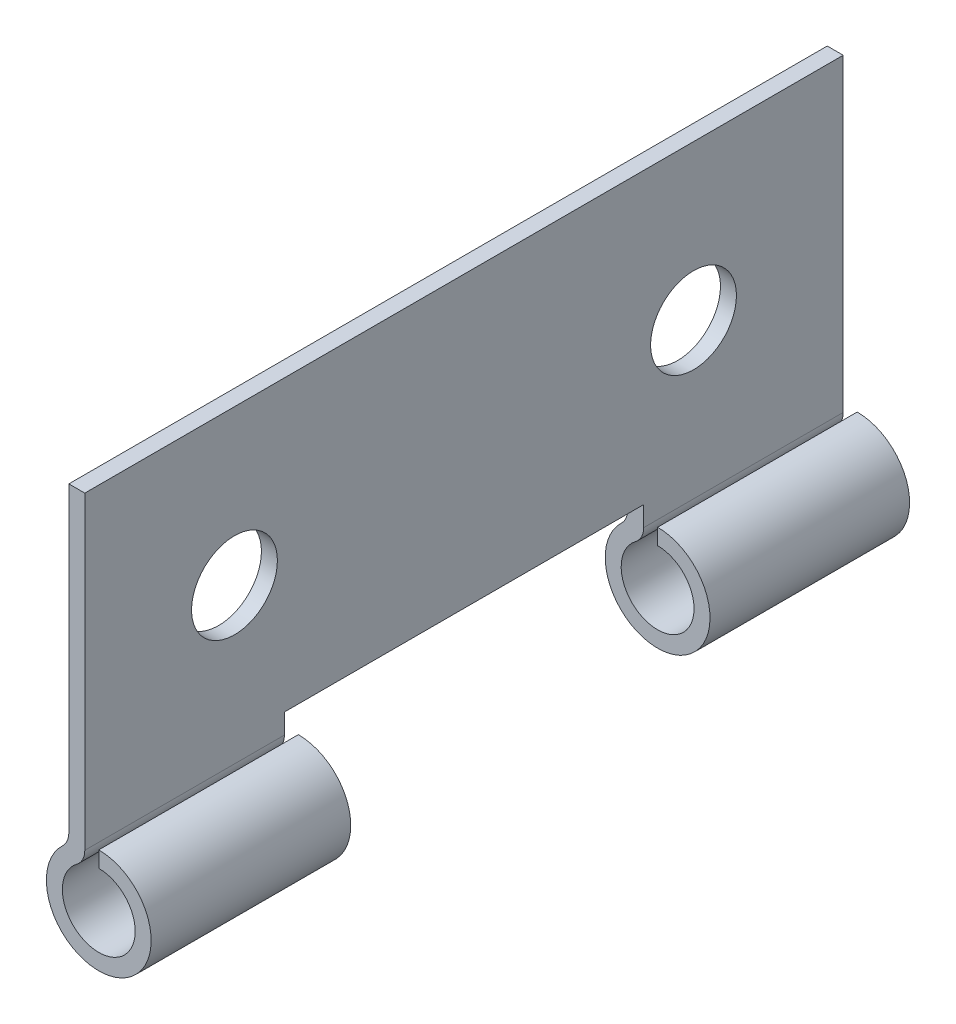
ISO-10303-21;
HEADER;
FILE_DESCRIPTION(('STEP AP214'),'2;1');
FILE_NAME('part.step','',(''),(''),'','','');
FILE_SCHEMA(('AUTOMOTIVE_DESIGN { 1 0 10303 214 1 1 1 1 }'));
ENDSEC;
DATA;
#1=APPLICATION_CONTEXT('core data for automotive mechanical design processes');
#2=APPLICATION_PROTOCOL_DEFINITION('international standard','automotive_design',2000,#1);
#3=PRODUCT_CONTEXT('',#1,'mechanical');
#4=PRODUCT('Part','Part','',(#3));
#5=PRODUCT_RELATED_PRODUCT_CATEGORY('part','',(#4));
#6=PRODUCT_DEFINITION_FORMATION('','',#4);
#7=PRODUCT_DEFINITION_CONTEXT('part definition',#1,'design');
#8=PRODUCT_DEFINITION('design','',#6,#7);
#9=PRODUCT_DEFINITION_SHAPE('','',#8);
#10=(LENGTH_UNIT() NAMED_UNIT(*) SI_UNIT(.MILLI.,.METRE.));
#11=(NAMED_UNIT(*) PLANE_ANGLE_UNIT() SI_UNIT($,.RADIAN.));
#12=(NAMED_UNIT(*) SI_UNIT($,.STERADIAN.) SOLID_ANGLE_UNIT());
#13=UNCERTAINTY_MEASURE_WITH_UNIT(LENGTH_MEASURE(1.E-05),#10,'distance_accuracy_value','');
#14=(GEOMETRIC_REPRESENTATION_CONTEXT(3) GLOBAL_UNCERTAINTY_ASSIGNED_CONTEXT((#13)) GLOBAL_UNIT_ASSIGNED_CONTEXT((#10,
#11,#12)) REPRESENTATION_CONTEXT('',''));
#15=CARTESIAN_POINT('',(0.,0.,0.));
#16=DIRECTION('',(0.,0.,1.));
#17=DIRECTION('',(1.,0.,0.));
#18=AXIS2_PLACEMENT_3D('',#15,#16,#17);
#19=CARTESIAN_POINT('',(0.,0.,38.));
#20=DIRECTION('',(1.,0.,0.));
#21=DIRECTION('',(0.,0.,-1.));
#22=AXIS2_PLACEMENT_3D('',#19,#20,#21);
#23=PLANE('',#22);
#24=CARTESIAN_POINT('',(0.,7.38124134347369,7.5));
#25=DIRECTION('',(1.,0.,0.));
#26=DIRECTION('',(0.,0.,-1.));
#27=AXIS2_PLACEMENT_3D('',#24,#25,#26);
#28=CIRCLE('',#27,2.15);
#29=CARTESIAN_POINT('',(0.,7.38124134347369,5.35));
#30=VERTEX_POINT('',#29);
#31=EDGE_CURVE('E248',#30,#30,#28,.F.);
#32=ORIENTED_EDGE('',*,*,#31,.F.);
#33=EDGE_LOOP('',(#32));
#34=FACE_BOUND('',#33,.T.);
#35=CARTESIAN_POINT('',(0.,7.38124134347369,30.5));
#36=DIRECTION('',(1.,0.,0.));
#37=DIRECTION('',(0.,0.,-1.));
#38=AXIS2_PLACEMENT_3D('',#35,#36,#37);
#39=CIRCLE('',#38,2.15);
#40=CARTESIAN_POINT('',(0.,7.38124134347369,28.35));
#41=VERTEX_POINT('',#40);
#42=EDGE_CURVE('E149',#41,#41,#39,.F.);
#43=ORIENTED_EDGE('',*,*,#42,.F.);
#44=EDGE_LOOP('',(#43));
#45=FACE_BOUND('',#44,.T.);
#46=DIRECTION('',(0.,-1.,0.));
#47=VECTOR('',#46,1.);
#48=CARTESIAN_POINT('',(0.,0.,9.99999999999999));
#49=LINE('',#48,#47);
#50=CARTESIAN_POINT('',(0.,0.631241343473685,10.));
#51=VERTEX_POINT('',#50);
#52=CARTESIAN_POINT('',(0.,0.,9.99999999999999));
#53=VERTEX_POINT('',#52);
#54=EDGE_CURVE('E241',#51,#53,#49,.T.);
#55=ORIENTED_EDGE('',*,*,#54,.F.);
#56=DIRECTION('',(0.,0.,-1.));
#57=VECTOR('',#56,1.);
#58=CARTESIAN_POINT('',(0.,0.631241343473685,38.));
#59=LINE('',#58,#57);
#60=CARTESIAN_POINT('',(0.,0.631241343473685,28.));
#61=VERTEX_POINT('',#60);
#62=EDGE_CURVE('E208',#61,#51,#59,.T.);
#63=ORIENTED_EDGE('',*,*,#62,.F.);
#64=DIRECTION('',(0.,-1.,0.));
#65=VECTOR('',#64,1.);
#66=CARTESIAN_POINT('',(0.,0.,28.));
#67=LINE('',#66,#65);
#68=CARTESIAN_POINT('',(0.,0.,28.));
#69=VERTEX_POINT('',#68);
#70=EDGE_CURVE('E223',#61,#69,#67,.T.);
#71=ORIENTED_EDGE('',*,*,#70,.T.);
#72=DIRECTION('',(0.,0.,-1.));
#73=VECTOR('',#72,1.);
#74=CARTESIAN_POINT('',(0.,0.,38.));
#75=LINE('',#74,#73);
#76=CARTESIAN_POINT('',(0.,0.,38.));
#77=VERTEX_POINT('',#76);
#78=EDGE_CURVE('E183',#77,#69,#75,.T.);
#79=ORIENTED_EDGE('',*,*,#78,.F.);
#80=DIRECTION('',(0.,-1.,0.));
#81=VECTOR('',#80,1.);
#82=CARTESIAN_POINT('',(0.,0.,38.));
#83=LINE('',#82,#81);
#84=CARTESIAN_POINT('',(0.,15.1312413434737,38.));
#85=VERTEX_POINT('',#84);
#86=EDGE_CURVE('E98',#85,#77,#83,.T.);
#87=ORIENTED_EDGE('',*,*,#86,.F.);
#88=DIRECTION('',(0.,0.,-1.));
#89=VECTOR('',#88,1.);
#90=CARTESIAN_POINT('',(0.,15.1312413434737,38.));
#91=LINE('',#90,#89);
#92=CARTESIAN_POINT('',(0.,15.1312413434737,0.));
#93=VERTEX_POINT('',#92);
#94=EDGE_CURVE('E186',#85,#93,#91,.T.);
#95=ORIENTED_EDGE('',*,*,#94,.T.);
#96=DIRECTION('',(0.,-1.,0.));
#97=VECTOR('',#96,1.);
#98=CARTESIAN_POINT('',(0.,0.,0.));
#99=LINE('',#98,#97);
#100=CARTESIAN_POINT('',(0.,0.,0.));
#101=VERTEX_POINT('',#100);
#102=EDGE_CURVE('E148',#93,#101,#99,.T.);
#103=ORIENTED_EDGE('',*,*,#102,.T.);
#104=EDGE_CURVE('E182',#53,#101,#75,.T.);
#105=ORIENTED_EDGE('',*,*,#104,.F.);
#106=EDGE_LOOP('',(#55,#63,#71,#79,#87,#95,#103,#105));
#107=FACE_BOUND('',#106,.T.);
#108=ADVANCED_FACE('F34',(#34,#45,#107),#23,.F.);
#109=CARTESIAN_POINT('',(-1.,0.,38.));
#110=DIRECTION('',(0.,0.,-1.));
#111=DIRECTION('',(-1.,0.,0.));
#112=AXIS2_PLACEMENT_3D('',#109,#110,#111);
#113=CYLINDRICAL_SURFACE('',#112,1.);
#114=CARTESIAN_POINT('',(-1.,0.,9.99999999999999));
#115=DIRECTION('',(0.,0.,1.));
#116=DIRECTION('',(1.,0.,0.));
#117=AXIS2_PLACEMENT_3D('',#114,#115,#116);
#118=CIRCLE('',#117,1.);
#119=CARTESIAN_POINT('',(-0.310344827586207,-0.724137931034484,9.99999999999999));
#120=VERTEX_POINT('',#119);
#121=EDGE_CURVE('E238',#53,#120,#118,.F.);
#122=ORIENTED_EDGE('',*,*,#121,.F.);
#123=ORIENTED_EDGE('',*,*,#104,.T.);
#124=CARTESIAN_POINT('',(-1.,0.,0.));
#125=DIRECTION('',(0.,0.,-1.));
#126=DIRECTION('',(-1.,0.,0.));
#127=AXIS2_PLACEMENT_3D('',#124,#125,#126);
#128=CIRCLE('',#127,1.);
#129=CARTESIAN_POINT('',(-0.310344827586207,-0.724137931034484,0.));
#130=VERTEX_POINT('',#129);
#131=EDGE_CURVE('E152',#101,#130,#128,.T.);
#132=ORIENTED_EDGE('',*,*,#131,.T.);
#133=DIRECTION('',(0.,0.,-1.));
#134=VECTOR('',#133,1.);
#135=CARTESIAN_POINT('',(-0.310344827586207,-0.724137931034484,38.));
#136=LINE('',#135,#134);
#137=EDGE_CURVE('E178',#120,#130,#136,.T.);
#138=ORIENTED_EDGE('',*,*,#137,.F.);
#139=EDGE_LOOP('',(#122,#123,#132,#138));
#140=FACE_BOUND('',#139,.T.);
#141=ADVANCED_FACE('F298',(#140),#113,.F.);
#142=CARTESIAN_POINT('',(1.5,-2.625,38.));
#143=DIRECTION('',(0.,0.,-1.));
#144=DIRECTION('',(-1.,0.,0.));
#145=AXIS2_PLACEMENT_3D('',#142,#143,#144);
#146=CYLINDRICAL_SURFACE('',#145,2.625);
#147=DIRECTION('',(0.,0.,-1.));
#148=VECTOR('',#147,1.);
#149=CARTESIAN_POINT('',(1.5,0.,38.));
#150=LINE('',#149,#148);
#151=CARTESIAN_POINT('',(1.5,0.,9.99999999999999));
#152=VERTEX_POINT('',#151);
#153=CARTESIAN_POINT('',(1.5,0.,0.));
#154=VERTEX_POINT('',#153);
#155=EDGE_CURVE('E174',#152,#154,#150,.T.);
#156=ORIENTED_EDGE('',*,*,#155,.F.);
#157=CARTESIAN_POINT('',(1.5,-2.625,9.99999999999999));
#158=DIRECTION('',(0.,0.,1.));
#159=DIRECTION('',(1.,0.,0.));
#160=AXIS2_PLACEMENT_3D('',#157,#158,#159);
#161=CIRCLE('',#160,2.625);
#162=EDGE_CURVE('E235',#120,#152,#161,.T.);
#163=ORIENTED_EDGE('',*,*,#162,.F.);
#164=ORIENTED_EDGE('',*,*,#137,.T.);
#165=CARTESIAN_POINT('',(1.5,-2.625,0.));
#166=DIRECTION('',(0.,0.,1.));
#167=DIRECTION('',(1.,0.,0.));
#168=AXIS2_PLACEMENT_3D('',#165,#166,#167);
#169=CIRCLE('',#168,2.625);
#170=EDGE_CURVE('E155',#130,#154,#169,.T.);
#171=ORIENTED_EDGE('',*,*,#170,.T.);
#172=EDGE_LOOP('',(#156,#163,#164,#171));
#173=FACE_BOUND('',#172,.T.);
#174=ADVANCED_FACE('F309',(#173),#146,.T.);
#175=CARTESIAN_POINT('',(1.5,-2.625,28.));
#176=DIRECTION('',(0.,0.,1.));
#177=DIRECTION('',(1.,0.,0.));
#178=AXIS2_PLACEMENT_3D('',#175,#176,#177);
#179=CIRCLE('',#178,2.625);
#180=CARTESIAN_POINT('',(-0.310344827586207,-0.724137931034484,28.));
#181=VERTEX_POINT('',#180);
#182=CARTESIAN_POINT('',(1.5,0.,28.));
#183=VERTEX_POINT('',#182);
#184=EDGE_CURVE('E217',#181,#183,#179,.T.);
#185=ORIENTED_EDGE('',*,*,#184,.T.);
#186=CARTESIAN_POINT('',(1.5,0.,38.));
#187=VERTEX_POINT('',#186);
#188=EDGE_CURVE('E175',#187,#183,#150,.T.);
#189=ORIENTED_EDGE('',*,*,#188,.F.);
#190=CARTESIAN_POINT('',(1.5,-2.625,38.));
#191=DIRECTION('',(0.,0.,1.));
#192=DIRECTION('',(1.,0.,0.));
#193=AXIS2_PLACEMENT_3D('',#190,#191,#192);
#194=CIRCLE('',#193,2.625);
#195=CARTESIAN_POINT('',(-0.310344827586207,-0.724137931034484,38.));
#196=VERTEX_POINT('',#195);
#197=EDGE_CURVE('E259',#196,#187,#194,.T.);
#198=ORIENTED_EDGE('',*,*,#197,.F.);
#199=EDGE_CURVE('E179',#196,#181,#136,.T.);
#200=ORIENTED_EDGE('',*,*,#199,.T.);
#201=EDGE_LOOP('',(#185,#189,#198,#200));
#202=FACE_BOUND('',#201,.T.);
#203=ADVANCED_FACE('F265',(#202),#146,.T.);
#204=CARTESIAN_POINT('',(1.5,0.,38.));
#205=DIRECTION('',(1.,0.,0.));
#206=DIRECTION('',(0.,0.,-1.));
#207=AXIS2_PLACEMENT_3D('',#204,#205,#206);
#208=PLANE('',#207);
#209=DIRECTION('',(0.,-1.,0.));
#210=VECTOR('',#209,1.);
#211=CARTESIAN_POINT('',(1.5,0.,9.99999999999999));
#212=LINE('',#211,#210);
#213=CARTESIAN_POINT('',(1.5,-0.8,9.99999999999999));
#214=VERTEX_POINT('',#213);
#215=EDGE_CURVE('E232',#152,#214,#212,.T.);
#216=ORIENTED_EDGE('',*,*,#215,.F.);
#217=ORIENTED_EDGE('',*,*,#155,.T.);
#218=DIRECTION('',(0.,-1.,0.));
#219=VECTOR('',#218,1.);
#220=CARTESIAN_POINT('',(1.5,0.,0.));
#221=LINE('',#220,#219);
#222=CARTESIAN_POINT('',(1.5,-0.8,0.));
#223=VERTEX_POINT('',#222);
#224=EDGE_CURVE('E158',#154,#223,#221,.T.);
#225=ORIENTED_EDGE('',*,*,#224,.T.);
#226=DIRECTION('',(0.,0.,-1.));
#227=VECTOR('',#226,1.);
#228=CARTESIAN_POINT('',(1.5,-0.8,38.));
#229=LINE('',#228,#227);
#230=EDGE_CURVE('E134',#214,#223,#229,.T.);
#231=ORIENTED_EDGE('',*,*,#230,.F.);
#232=EDGE_LOOP('',(#216,#217,#225,#231));
#233=FACE_BOUND('',#232,.T.);
#234=ADVANCED_FACE('F314',(#233),#208,.F.);
#235=CARTESIAN_POINT('',(1.5,-2.625,38.));
#236=DIRECTION('',(0.,0.,-1.));
#237=DIRECTION('',(-1.,0.,0.));
#238=AXIS2_PLACEMENT_3D('',#235,#236,#237);
#239=CYLINDRICAL_SURFACE('',#238,1.825);
#240=CARTESIAN_POINT('',(1.5,-2.625,9.99999999999999));
#241=DIRECTION('',(0.,0.,1.));
#242=DIRECTION('',(1.,0.,0.));
#243=AXIS2_PLACEMENT_3D('',#240,#241,#242);
#244=CIRCLE('',#243,1.825);
#245=CARTESIAN_POINT('',(0.401769911504423,-1.16742815864089,9.99999999999999));
#246=VERTEX_POINT('',#245);
#247=EDGE_CURVE('E229',#214,#246,#244,.F.);
#248=ORIENTED_EDGE('',*,*,#247,.F.);
#249=ORIENTED_EDGE('',*,*,#230,.T.);
#250=CARTESIAN_POINT('',(1.5,-2.625,0.));
#251=DIRECTION('',(0.,0.,-1.));
#252=DIRECTION('',(1.,0.,0.));
#253=AXIS2_PLACEMENT_3D('',#250,#251,#252);
#254=CIRCLE('',#253,1.825);
#255=CARTESIAN_POINT('',(0.401769911504423,-1.16742815864089,0.));
#256=VERTEX_POINT('',#255);
#257=EDGE_CURVE('E161',#223,#256,#254,.T.);
#258=ORIENTED_EDGE('',*,*,#257,.T.);
#259=DIRECTION('',(0.,0.,-1.));
#260=VECTOR('',#259,1.);
#261=CARTESIAN_POINT('',(0.401769911504423,-1.16742815864089,38.));
#262=LINE('',#261,#260);
#263=EDGE_CURVE('E135',#246,#256,#262,.T.);
#264=ORIENTED_EDGE('',*,*,#263,.F.);
#265=EDGE_LOOP('',(#248,#249,#258,#264));
#266=FACE_BOUND('',#265,.T.);
#267=ADVANCED_FACE('F316',(#266),#239,.F.);
#268=CARTESIAN_POINT('',(-0.200000000000001,-0.368758656526303,38.));
#269=DIRECTION('',(0.,0.,-1.));
#270=DIRECTION('',(-1.,0.,0.));
#271=AXIS2_PLACEMENT_3D('',#268,#269,#270);
#272=CYLINDRICAL_SURFACE('',#271,1.);
#273=CARTESIAN_POINT('',(-0.200000000000001,-0.368758656526303,9.99999999999999));
#274=DIRECTION('',(0.,0.,1.));
#275=DIRECTION('',(1.,0.,0.));
#276=AXIS2_PLACEMENT_3D('',#273,#274,#275);
#277=CIRCLE('',#276,1.);
#278=CARTESIAN_POINT('',(0.799999999999999,-0.368758656526303,9.99999999999999));
#279=VERTEX_POINT('',#278);
#280=EDGE_CURVE('E226',#246,#279,#277,.T.);
#281=ORIENTED_EDGE('',*,*,#280,.F.);
#282=ORIENTED_EDGE('',*,*,#263,.T.);
#283=CARTESIAN_POINT('',(-0.200000000000001,-0.368758656526303,0.));
#284=DIRECTION('',(0.,0.,1.));
#285=DIRECTION('',(1.,0.,0.));
#286=AXIS2_PLACEMENT_3D('',#283,#284,#285);
#287=CIRCLE('',#286,1.);
#288=CARTESIAN_POINT('',(0.799999999999999,-0.368758656526303,0.));
#289=VERTEX_POINT('',#288);
#290=EDGE_CURVE('E164',#256,#289,#287,.T.);
#291=ORIENTED_EDGE('',*,*,#290,.T.);
#292=DIRECTION('',(0.,0.,-1.));
#293=VECTOR('',#292,1.);
#294=CARTESIAN_POINT('',(0.799999999999999,-0.368758656526303,38.));
#295=LINE('',#294,#293);
#296=EDGE_CURVE('E170',#279,#289,#295,.T.);
#297=ORIENTED_EDGE('',*,*,#296,.F.);
#298=EDGE_LOOP('',(#281,#282,#291,#297));
#299=FACE_BOUND('',#298,.T.);
#300=ADVANCED_FACE('F322',(#299),#272,.T.);
#301=CARTESIAN_POINT('',(0.799999999999999,-0.368758656526303,38.));
#302=DIRECTION('',(-1.,0.,0.));
#303=DIRECTION('',(0.,0.,1.));
#304=AXIS2_PLACEMENT_3D('',#301,#302,#303);
#305=PLANE('',#304);
#306=CARTESIAN_POINT('',(0.799999999999999,7.38124134347369,7.5));
#307=DIRECTION('',(1.,0.,0.));
#308=DIRECTION('',(0.,0.,-1.));
#309=AXIS2_PLACEMENT_3D('',#306,#307,#308);
#310=CIRCLE('',#309,2.15);
#311=CARTESIAN_POINT('',(0.799999999999999,7.38124134347369,5.35));
#312=VERTEX_POINT('',#311);
#313=EDGE_CURVE('E244',#312,#312,#310,.T.);
#314=ORIENTED_EDGE('',*,*,#313,.F.);
#315=EDGE_LOOP('',(#314));
#316=FACE_BOUND('',#315,.T.);
#317=CARTESIAN_POINT('',(0.799999999999999,7.38124134347369,30.5));
#318=DIRECTION('',(1.,0.,0.));
#319=DIRECTION('',(0.,0.,-1.));
#320=AXIS2_PLACEMENT_3D('',#317,#318,#319);
#321=CIRCLE('',#320,2.15);
#322=CARTESIAN_POINT('',(0.799999999999999,7.38124134347369,28.35));
#323=VERTEX_POINT('',#322);
#324=EDGE_CURVE('E245',#323,#323,#321,.T.);
#325=ORIENTED_EDGE('',*,*,#324,.F.);
#326=EDGE_LOOP('',(#325));
#327=FACE_BOUND('',#326,.T.);
#328=DIRECTION('',(0.,1.,0.));
#329=VECTOR('',#328,1.);
#330=CARTESIAN_POINT('',(0.799999999999999,-0.368758656526303,9.99999999999999));
#331=LINE('',#330,#329);
#332=CARTESIAN_POINT('',(0.799999999999999,0.631241343473685,10.));
#333=VERTEX_POINT('',#332);
#334=EDGE_CURVE('E11',#279,#333,#331,.T.);
#335=ORIENTED_EDGE('',*,*,#334,.F.);
#336=ORIENTED_EDGE('',*,*,#296,.T.);
#337=DIRECTION('',(0.,1.,0.));
#338=VECTOR('',#337,1.);
#339=CARTESIAN_POINT('',(0.799999999999999,-0.368758656526303,0.));
#340=LINE('',#339,#338);
#341=CARTESIAN_POINT('',(0.799999999999999,15.1312413434737,0.));
#342=VERTEX_POINT('',#341);
#343=EDGE_CURVE('E89',#289,#342,#340,.T.);
#344=ORIENTED_EDGE('',*,*,#343,.T.);
#345=DIRECTION('',(0.,0.,-1.));
#346=VECTOR('',#345,1.);
#347=CARTESIAN_POINT('',(0.799999999999999,15.1312413434737,38.));
#348=LINE('',#347,#346);
#349=CARTESIAN_POINT('',(0.799999999999999,15.1312413434737,38.));
#350=VERTEX_POINT('',#349);
#351=EDGE_CURVE('E141',#350,#342,#348,.T.);
#352=ORIENTED_EDGE('',*,*,#351,.F.);
#353=DIRECTION('',(0.,1.,0.));
#354=VECTOR('',#353,1.);
#355=CARTESIAN_POINT('',(0.799999999999999,-0.368758656526303,38.));
#356=LINE('',#355,#354);
#357=CARTESIAN_POINT('',(0.799999999999999,-0.368758656526303,38.));
#358=VERTEX_POINT('',#357);
#359=EDGE_CURVE('E57',#358,#350,#356,.T.);
#360=ORIENTED_EDGE('',*,*,#359,.F.);
#361=CARTESIAN_POINT('',(0.799999999999999,-0.368758656526303,28.));
#362=VERTEX_POINT('',#361);
#363=EDGE_CURVE('E139',#358,#362,#295,.T.);
#364=ORIENTED_EDGE('',*,*,#363,.T.);
#365=DIRECTION('',(0.,1.,0.));
#366=VECTOR('',#365,1.);
#367=CARTESIAN_POINT('',(0.799999999999999,-0.368758656526303,28.));
#368=LINE('',#367,#366);
#369=CARTESIAN_POINT('',(0.799999999999999,0.631241343473685,28.));
#370=VERTEX_POINT('',#369);
#371=EDGE_CURVE('E42',#362,#370,#368,.T.);
#372=ORIENTED_EDGE('',*,*,#371,.T.);
#373=DIRECTION('',(0.,0.,1.));
#374=VECTOR('',#373,1.);
#375=CARTESIAN_POINT('',(0.799999999999999,0.631241343473685,38.));
#376=LINE('',#375,#374);
#377=EDGE_CURVE('E188',#333,#370,#376,.T.);
#378=ORIENTED_EDGE('',*,*,#377,.F.);
#379=EDGE_LOOP('',(#335,#336,#344,#352,#360,#364,#372,#378));
#380=FACE_BOUND('',#379,.T.);
#381=ADVANCED_FACE('F194',(#316,#327,#380),#305,.F.);
#382=CARTESIAN_POINT('',(0.,15.1312413434737,38.));
#383=DIRECTION('',(0.,-1.,0.));
#384=DIRECTION('',(0.,0.,-1.));
#385=AXIS2_PLACEMENT_3D('',#382,#383,#384);
#386=PLANE('',#385);
#387=DIRECTION('',(-1.,0.,0.));
#388=VECTOR('',#387,1.);
#389=CARTESIAN_POINT('',(0.,15.1312413434737,0.));
#390=LINE('',#389,#388);
#391=EDGE_CURVE('E145',#342,#93,#390,.T.);
#392=ORIENTED_EDGE('',*,*,#391,.T.);
#393=ORIENTED_EDGE('',*,*,#94,.F.);
#394=DIRECTION('',(-1.,0.,0.));
#395=VECTOR('',#394,1.);
#396=CARTESIAN_POINT('',(0.,15.1312413434737,38.));
#397=LINE('',#396,#395);
#398=EDGE_CURVE('E168',#350,#85,#397,.T.);
#399=ORIENTED_EDGE('',*,*,#398,.F.);
#400=ORIENTED_EDGE('',*,*,#351,.T.);
#401=EDGE_LOOP('',(#392,#393,#399,#400));
#402=FACE_BOUND('',#401,.T.);
#403=ADVANCED_FACE('F36',(#402),#386,.F.);
#404=ORIENTED_EDGE('',*,*,#78,.T.);
#405=CARTESIAN_POINT('',(-1.,0.,28.));
#406=DIRECTION('',(0.,0.,1.));
#407=DIRECTION('',(1.,0.,0.));
#408=AXIS2_PLACEMENT_3D('',#405,#406,#407);
#409=CIRCLE('',#408,1.);
#410=EDGE_CURVE('E220',#69,#181,#409,.F.);
#411=ORIENTED_EDGE('',*,*,#410,.T.);
#412=ORIENTED_EDGE('',*,*,#199,.F.);
#413=CARTESIAN_POINT('',(-1.,0.,38.));
#414=DIRECTION('',(0.,0.,-1.));
#415=DIRECTION('',(-1.,0.,0.));
#416=AXIS2_PLACEMENT_3D('',#413,#414,#415);
#417=CIRCLE('',#416,1.);
#418=EDGE_CURVE('E257',#77,#196,#417,.T.);
#419=ORIENTED_EDGE('',*,*,#418,.F.);
#420=EDGE_LOOP('',(#404,#411,#412,#419));
#421=FACE_BOUND('',#420,.T.);
#422=ADVANCED_FACE('F326',(#421),#113,.F.);
#423=ORIENTED_EDGE('',*,*,#188,.T.);
#424=DIRECTION('',(0.,-1.,0.));
#425=VECTOR('',#424,1.);
#426=CARTESIAN_POINT('',(1.5,0.,28.));
#427=LINE('',#426,#425);
#428=CARTESIAN_POINT('',(1.5,-0.8,28.));
#429=VERTEX_POINT('',#428);
#430=EDGE_CURVE('E210',#183,#429,#427,.T.);
#431=ORIENTED_EDGE('',*,*,#430,.T.);
#432=CARTESIAN_POINT('',(1.5,-0.8,38.));
#433=VERTEX_POINT('',#432);
#434=EDGE_CURVE('E172',#433,#429,#229,.T.);
#435=ORIENTED_EDGE('',*,*,#434,.F.);
#436=DIRECTION('',(0.,-1.,0.));
#437=VECTOR('',#436,1.);
#438=CARTESIAN_POINT('',(1.5,0.,38.));
#439=LINE('',#438,#437);
#440=EDGE_CURVE('E120',#187,#433,#439,.T.);
#441=ORIENTED_EDGE('',*,*,#440,.F.);
#442=EDGE_LOOP('',(#423,#431,#435,#441));
#443=FACE_BOUND('',#442,.T.);
#444=ADVANCED_FACE('F270',(#443),#208,.F.);
#445=ORIENTED_EDGE('',*,*,#434,.T.);
#446=CARTESIAN_POINT('',(1.5,-2.625,28.));
#447=DIRECTION('',(0.,0.,1.));
#448=DIRECTION('',(1.,0.,0.));
#449=AXIS2_PLACEMENT_3D('',#446,#447,#448);
#450=CIRCLE('',#449,1.825);
#451=CARTESIAN_POINT('',(0.401769911504423,-1.16742815864089,28.));
#452=VERTEX_POINT('',#451);
#453=EDGE_CURVE('E131',#429,#452,#450,.F.);
#454=ORIENTED_EDGE('',*,*,#453,.T.);
#455=CARTESIAN_POINT('',(0.401769911504423,-1.16742815864089,38.));
#456=VERTEX_POINT('',#455);
#457=EDGE_CURVE('E127',#456,#452,#262,.T.);
#458=ORIENTED_EDGE('',*,*,#457,.F.);
#459=CARTESIAN_POINT('',(1.5,-2.625,38.));
#460=DIRECTION('',(0.,0.,-1.));
#461=DIRECTION('',(1.,0.,0.));
#462=AXIS2_PLACEMENT_3D('',#459,#460,#461);
#463=CIRCLE('',#462,1.825);
#464=EDGE_CURVE('E113',#433,#456,#463,.T.);
#465=ORIENTED_EDGE('',*,*,#464,.F.);
#466=EDGE_LOOP('',(#445,#454,#458,#465));
#467=FACE_BOUND('',#466,.T.);
#468=ADVANCED_FACE('F128',(#467),#239,.F.);
#469=ORIENTED_EDGE('',*,*,#457,.T.);
#470=CARTESIAN_POINT('',(-0.200000000000001,-0.368758656526303,28.));
#471=DIRECTION('',(0.,0.,1.));
#472=DIRECTION('',(1.,0.,0.));
#473=AXIS2_PLACEMENT_3D('',#470,#471,#472);
#474=CIRCLE('',#473,1.);
#475=EDGE_CURVE('E203',#452,#362,#474,.T.);
#476=ORIENTED_EDGE('',*,*,#475,.T.);
#477=ORIENTED_EDGE('',*,*,#363,.F.);
#478=CARTESIAN_POINT('',(-0.200000000000001,-0.368758656526303,38.));
#479=DIRECTION('',(0.,0.,1.));
#480=DIRECTION('',(1.,0.,0.));
#481=AXIS2_PLACEMENT_3D('',#478,#479,#480);
#482=CIRCLE('',#481,1.);
#483=EDGE_CURVE('E117',#456,#358,#482,.T.);
#484=ORIENTED_EDGE('',*,*,#483,.F.);
#485=EDGE_LOOP('',(#469,#476,#477,#484));
#486=FACE_BOUND('',#485,.T.);
#487=ADVANCED_FACE('F137',(#486),#272,.T.);
#488=CARTESIAN_POINT('',(-0.200000000000001,-0.368758656526303,38.));
#489=DIRECTION('',(0.,0.,1.));
#490=DIRECTION('',(1.,0.,0.));
#491=AXIS2_PLACEMENT_3D('',#488,#489,#490);
#492=PLANE('',#491);
#493=ORIENTED_EDGE('',*,*,#398,.T.);
#494=ORIENTED_EDGE('',*,*,#86,.T.);
#495=ORIENTED_EDGE('',*,*,#418,.T.);
#496=ORIENTED_EDGE('',*,*,#197,.T.);
#497=ORIENTED_EDGE('',*,*,#440,.T.);
#498=ORIENTED_EDGE('',*,*,#464,.T.);
#499=ORIENTED_EDGE('',*,*,#483,.T.);
#500=ORIENTED_EDGE('',*,*,#359,.T.);
#501=EDGE_LOOP('',(#493,#494,#495,#496,#497,#498,#499,#500));
#502=FACE_BOUND('',#501,.T.);
#503=ADVANCED_FACE('F115',(#502),#492,.T.);
#504=CARTESIAN_POINT('',(-0.200000000000001,-0.368758656526303,0.));
#505=DIRECTION('',(0.,0.,1.));
#506=DIRECTION('',(1.,0.,0.));
#507=AXIS2_PLACEMENT_3D('',#504,#505,#506);
#508=PLANE('',#507);
#509=ORIENTED_EDGE('',*,*,#391,.F.);
#510=ORIENTED_EDGE('',*,*,#343,.F.);
#511=ORIENTED_EDGE('',*,*,#290,.F.);
#512=ORIENTED_EDGE('',*,*,#257,.F.);
#513=ORIENTED_EDGE('',*,*,#224,.F.);
#514=ORIENTED_EDGE('',*,*,#170,.F.);
#515=ORIENTED_EDGE('',*,*,#131,.F.);
#516=ORIENTED_EDGE('',*,*,#102,.F.);
#517=EDGE_LOOP('',(#509,#510,#511,#512,#513,#514,#515,#516));
#518=FACE_BOUND('',#517,.T.);
#519=ADVANCED_FACE('F304',(#518),#508,.F.);
#520=CARTESIAN_POINT('',(-1.126,7.38124134347369,7.5));
#521=DIRECTION('',(1.,0.,0.));
#522=DIRECTION('',(0.,0.,-1.));
#523=AXIS2_PLACEMENT_3D('',#520,#521,#522);
#524=CYLINDRICAL_SURFACE('',#523,2.15);
#525=ORIENTED_EDGE('',*,*,#313,.T.);
#526=EDGE_LOOP('',(#525));
#527=FACE_BOUND('',#526,.T.);
#528=ORIENTED_EDGE('',*,*,#31,.T.);
#529=EDGE_LOOP('',(#528));
#530=FACE_BOUND('',#529,.T.);
#531=ADVANCED_FACE('F361',(#527,#530),#524,.F.);
#532=CARTESIAN_POINT('',(-1.126,7.38124134347369,30.5));
#533=DIRECTION('',(1.,0.,0.));
#534=DIRECTION('',(0.,0.,-1.));
#535=AXIS2_PLACEMENT_3D('',#532,#533,#534);
#536=CYLINDRICAL_SURFACE('',#535,2.15);
#537=ORIENTED_EDGE('',*,*,#324,.T.);
#538=EDGE_LOOP('',(#537));
#539=FACE_BOUND('',#538,.T.);
#540=ORIENTED_EDGE('',*,*,#42,.T.);
#541=EDGE_LOOP('',(#540));
#542=FACE_BOUND('',#541,.T.);
#543=ADVANCED_FACE('F366',(#539,#542),#536,.F.);
#544=CARTESIAN_POINT('',(-1.125,0.,10.));
#545=DIRECTION('',(0.,0.,1.));
#546=DIRECTION('',(1.,0.,0.));
#547=AXIS2_PLACEMENT_3D('',#544,#545,#546);
#548=PLANE('',#547);
#549=ORIENTED_EDGE('',*,*,#54,.T.);
#550=ORIENTED_EDGE('',*,*,#121,.T.);
#551=ORIENTED_EDGE('',*,*,#162,.T.);
#552=ORIENTED_EDGE('',*,*,#215,.T.);
#553=ORIENTED_EDGE('',*,*,#247,.T.);
#554=ORIENTED_EDGE('',*,*,#280,.T.);
#555=ORIENTED_EDGE('',*,*,#334,.T.);
#556=DIRECTION('',(1.,0.,0.));
#557=VECTOR('',#556,1.);
#558=CARTESIAN_POINT('',(-1.125,0.631241343473685,10.));
#559=LINE('',#558,#557);
#560=EDGE_CURVE('E49',#51,#333,#559,.T.);
#561=ORIENTED_EDGE('',*,*,#560,.F.);
#562=EDGE_LOOP('',(#549,#550,#551,#552,#553,#554,#555,#561));
#563=FACE_BOUND('',#562,.T.);
#564=ADVANCED_FACE('F293',(#563),#548,.T.);
#565=CARTESIAN_POINT('',(-1.125,0.,28.));
#566=DIRECTION('',(0.,0.,1.));
#567=DIRECTION('',(1.,0.,0.));
#568=AXIS2_PLACEMENT_3D('',#565,#566,#567);
#569=PLANE('',#568);
#570=DIRECTION('',(1.,0.,0.));
#571=VECTOR('',#570,1.);
#572=CARTESIAN_POINT('',(-1.125,0.631241343473685,28.));
#573=LINE('',#572,#571);
#574=EDGE_CURVE('E206',#61,#370,#573,.T.);
#575=ORIENTED_EDGE('',*,*,#574,.T.);
#576=ORIENTED_EDGE('',*,*,#371,.F.);
#577=ORIENTED_EDGE('',*,*,#475,.F.);
#578=ORIENTED_EDGE('',*,*,#453,.F.);
#579=ORIENTED_EDGE('',*,*,#430,.F.);
#580=ORIENTED_EDGE('',*,*,#184,.F.);
#581=ORIENTED_EDGE('',*,*,#410,.F.);
#582=ORIENTED_EDGE('',*,*,#70,.F.);
#583=EDGE_LOOP('',(#575,#576,#577,#578,#579,#580,#581,#582));
#584=FACE_BOUND('',#583,.T.);
#585=ADVANCED_FACE('F202',(#584),#569,.F.);
#586=CARTESIAN_POINT('',(-1.125,0.631241343473685,0.));
#587=DIRECTION('',(0.,-1.,0.));
#588=DIRECTION('',(0.,0.,-1.));
#589=AXIS2_PLACEMENT_3D('',#586,#587,#588);
#590=PLANE('',#589);
#591=ORIENTED_EDGE('',*,*,#62,.T.);
#592=ORIENTED_EDGE('',*,*,#560,.T.);
#593=ORIENTED_EDGE('',*,*,#377,.T.);
#594=ORIENTED_EDGE('',*,*,#574,.F.);
#595=EDGE_LOOP('',(#591,#592,#593,#594));
#596=FACE_BOUND('',#595,.T.);
#597=ADVANCED_FACE('F328',(#596),#590,.T.);
#598=CLOSED_SHELL('',(#108,#141,#174,#203,#234,#267,#300,#381,#403,#422,#444,#468,#487,#503,
#519,#531,#543,#564,#585,#597));
#599=MANIFOLD_SOLID_BREP('B2',#598);
#600=ADVANCED_BREP_SHAPE_REPRESENTATION('',(#18,#599),#14);
#601=SHAPE_DEFINITION_REPRESENTATION(#9,#600);
ENDSEC;
END-ISO-10303-21;
